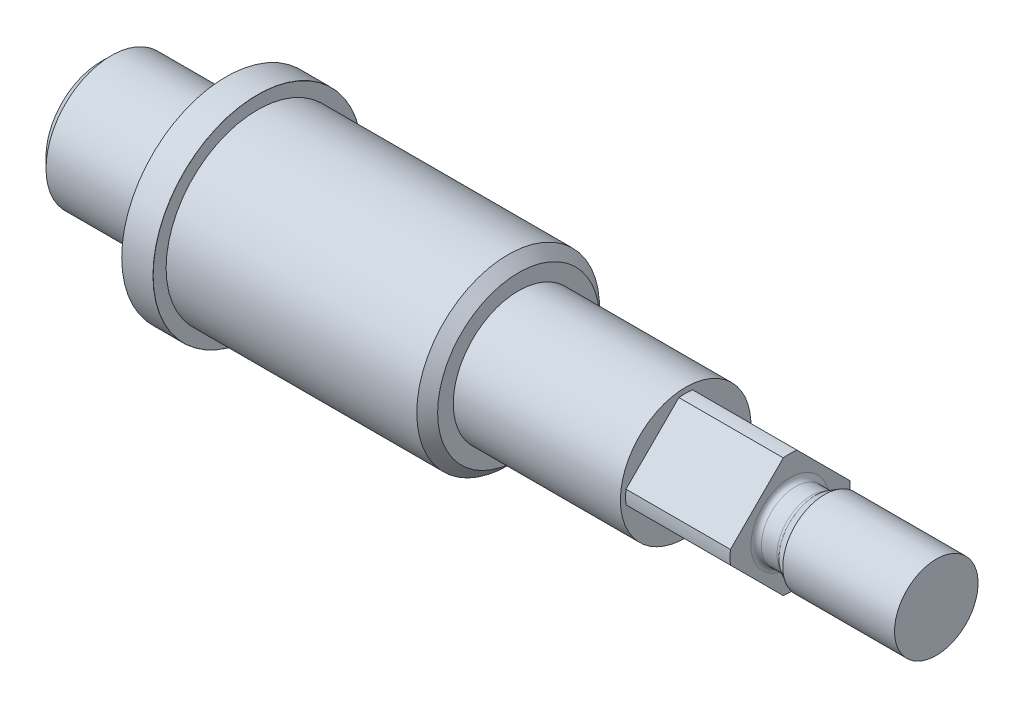
ISO-10303-21;
HEADER;
FILE_DESCRIPTION(('STEP AP214'),'2;1');
FILE_NAME('part.step','',(''),(''),'','','');
FILE_SCHEMA(('AUTOMOTIVE_DESIGN { 1 0 10303 214 1 1 1 1 }'));
ENDSEC;
DATA;
#1=APPLICATION_CONTEXT('core data for automotive mechanical design processes');
#2=APPLICATION_PROTOCOL_DEFINITION('international standard','automotive_design',2000,#1);
#3=PRODUCT_CONTEXT('',#1,'mechanical');
#4=PRODUCT('Part','Part','',(#3));
#5=PRODUCT_RELATED_PRODUCT_CATEGORY('part','',(#4));
#6=PRODUCT_DEFINITION_FORMATION('','',#4);
#7=PRODUCT_DEFINITION_CONTEXT('part definition',#1,'design');
#8=PRODUCT_DEFINITION('design','',#6,#7);
#9=PRODUCT_DEFINITION_SHAPE('','',#8);
#10=(LENGTH_UNIT() NAMED_UNIT(*) SI_UNIT(.MILLI.,.METRE.));
#11=(NAMED_UNIT(*) PLANE_ANGLE_UNIT() SI_UNIT($,.RADIAN.));
#12=(NAMED_UNIT(*) SI_UNIT($,.STERADIAN.) SOLID_ANGLE_UNIT());
#13=UNCERTAINTY_MEASURE_WITH_UNIT(LENGTH_MEASURE(1.E-05),#10,'distance_accuracy_value','');
#14=(GEOMETRIC_REPRESENTATION_CONTEXT(3) GLOBAL_UNCERTAINTY_ASSIGNED_CONTEXT((#13)) GLOBAL_UNIT_ASSIGNED_CONTEXT((#10,
#11,#12)) REPRESENTATION_CONTEXT('',''));
#15=CARTESIAN_POINT('',(0.,0.,0.));
#16=DIRECTION('',(0.,0.,1.));
#17=DIRECTION('',(1.,0.,0.));
#18=AXIS2_PLACEMENT_3D('',#15,#16,#17);
#19=CARTESIAN_POINT('',(-33.02,0.,-20.));
#20=DIRECTION('',(0.,0.,1.));
#21=DIRECTION('',(1.,0.,0.));
#22=AXIS2_PLACEMENT_3D('',#19,#20,#21);
#23=CYLINDRICAL_SURFACE('',#22,5.);
#24=CARTESIAN_POINT('',(-33.02,0.,-12.5));
#25=DIRECTION('',(0.,0.,1.));
#26=DIRECTION('',(1.,0.,0.));
#27=AXIS2_PLACEMENT_3D('',#24,#25,#26);
#28=CIRCLE('',#27,5.);
#29=CARTESIAN_POINT('',(-33.02,5.,-12.5));
#30=VERTEX_POINT('',#29);
#31=CARTESIAN_POINT('',(-33.02,-5.,-12.5));
#32=VERTEX_POINT('',#31);
#33=EDGE_CURVE('E147',#30,#32,#28,.T.);
#34=ORIENTED_EDGE('',*,*,#33,.T.);
#35=DIRECTION('',(0.,0.,1.));
#36=VECTOR('',#35,1.);
#37=CARTESIAN_POINT('',(-33.02,-5.,-20.));
#38=LINE('',#37,#36);
#39=CARTESIAN_POINT('',(-33.02,-5.,-16.7705098312484));
#40=VERTEX_POINT('',#39);
#41=EDGE_CURVE('E135',#40,#32,#38,.T.);
#42=ORIENTED_EDGE('',*,*,#41,.F.);
#43=CARTESIAN_POINT('',(-33.02,5.,-16.7705098312484));
#44=CARTESIAN_POINT('',(-33.1575437669468,5.00001814544053,-16.7704912725158));
#45=CARTESIAN_POINT('',(-33.2950806220229,4.99432529208164,-16.7722013219269));
#46=CARTESIAN_POINT('',(-33.5691111892844,4.97165222541634,-16.7789431019967));
#47=CARTESIAN_POINT('',(-33.7056051118428,4.95467435267923,-16.7839741438635));
#48=CARTESIAN_POINT('',(-33.9762584540195,4.90961903685605,-16.7972068372471));
#49=CARTESIAN_POINT('',(-34.1104226248333,4.88156789644729,-16.8054009743523));
#50=CARTESIAN_POINT('',(-34.3757996419888,4.81461674604718,-16.8247046364186));
#51=CARTESIAN_POINT('',(-34.507012422422,4.77571649404059,-16.8358142264156));
#52=CARTESIAN_POINT('',(-34.7655316606223,4.68740449021953,-16.8606149796878));
#53=CARTESIAN_POINT('',(-34.892840055364,4.63799805032664,-16.874304837985));
#54=CARTESIAN_POINT('',(-35.1427993627257,4.52905522001709,-16.9038705765848));
#55=CARTESIAN_POINT('',(-35.2654485233715,4.46951506432955,-16.9197472690052));
#56=CARTESIAN_POINT('',(-35.625208360307,4.27631278448765,-16.9699997678901));
#57=CARTESIAN_POINT('',(-35.8542983618955,4.12801150136262,-17.007014905076));
#58=CARTESIAN_POINT('',(-36.2905139648693,3.79229915782691,-17.0850471293107));
#59=CARTESIAN_POINT('',(-36.496920274657,3.60397767000144,-17.1261428352533));
#60=CARTESIAN_POINT('',(-36.8757376930736,3.19544341696382,-17.2070462516998));
#61=CARTESIAN_POINT('',(-37.048143164041,2.97522537348191,-17.2468537476932));
#62=CARTESIAN_POINT('',(-37.3570780919675,2.5041085165938,-17.3215844019062));
#63=CARTESIAN_POINT('',(-37.4928809242985,2.25271539483174,-17.3564029869975));
#64=CARTESIAN_POINT('',(-37.7200077123923,1.72950937060037,-17.4163145657263));
#65=CARTESIAN_POINT('',(-37.8113423051881,1.45770136944961,-17.4414098849257));
#66=CARTESIAN_POINT('',(-37.9445857008507,0.908899275051303,-17.4784878135792));
#67=CARTESIAN_POINT('',(-37.9877218545897,0.632225504452072,-17.4907954521753));
#68=CARTESIAN_POINT('',(-38.0272166941546,0.0753060921048364,-17.5020523750682));
#69=CARTESIAN_POINT('',(-38.0235833309957,-0.204938934421976,-17.5010039299558));
#70=CARTESIAN_POINT('',(-37.9704845198055,-0.752451373530216,-17.4859002467781));
#71=CARTESIAN_POINT('',(-37.9223476007258,-1.0198597093415,-17.4722220494947));
#72=CARTESIAN_POINT('',(-37.7837591704515,-1.54263514692821,-17.433846479088));
#73=CARTESIAN_POINT('',(-37.6933055229895,-1.79800164008106,-17.4091485496606));
#74=CARTESIAN_POINT('',(-37.4717336287344,-2.29267928834747,-17.3509771517082));
#75=CARTESIAN_POINT('',(-37.3401810479175,-2.53178407311227,-17.3174105731756));
#76=CARTESIAN_POINT('',(-37.0403556664245,-2.98504901208546,-17.245062612945));
#77=CARTESIAN_POINT('',(-36.8720754127235,-3.19920408978386,-17.2062801734237));
#78=CARTESIAN_POINT('',(-36.5923726411755,-3.50113424709606,-17.1465202223136));
#79=CARTESIAN_POINT('',(-36.4926361356536,-3.60007423743551,-17.1259700648702));
#80=CARTESIAN_POINT('',(-36.2851797576601,-3.78923134613091,-17.0851123940087));
#81=CARTESIAN_POINT('',(-36.1774626601299,-3.87945147156873,-17.0648047990745));
#82=CARTESIAN_POINT('',(-35.9546549590068,-4.05062437518906,-17.0249868857383));
#83=CARTESIAN_POINT('',(-35.8395594701279,-4.13157091233148,-17.005477109874));
#84=CARTESIAN_POINT('',(-35.602839206299,-4.28353981460235,-16.9678346429649));
#85=CARTESIAN_POINT('',(-35.4812169966662,-4.35456603991598,-16.9497014175386));
#86=CARTESIAN_POINT('',(-35.2310840486818,-4.48679157824972,-16.9151829895461));
#87=CARTESIAN_POINT('',(-35.1025213722029,-4.5478971849676,-16.898814896638));
#88=CARTESIAN_POINT('',(-34.84045850364,-4.65898872141545,-16.8685251216221));
#89=CARTESIAN_POINT('',(-34.7069603422388,-4.70897916633162,-16.8546024466245));
#90=CARTESIAN_POINT('',(-34.4360789886437,-4.79739484975374,-16.829649854127));
#91=CARTESIAN_POINT('',(-34.2987000207409,-4.83583217063301,-16.8186169160755));
#92=CARTESIAN_POINT('',(-34.0210044543476,-4.90084834749729,-16.7997865631929));
#93=CARTESIAN_POINT('',(-33.8806892484807,-4.92743269748005,-16.7919876494693));
#94=CARTESIAN_POINT('',(-33.6203348857874,-4.96528740578587,-16.7808301521248));
#95=CARTESIAN_POINT('',(-33.5005683702716,-4.97830600651658,-16.776966894118));
#96=CARTESIAN_POINT('',(-33.2605377051843,-4.99566040544728,-16.7718034889731));
#97=CARTESIAN_POINT('',(-33.140274596223,-5.00000944654161,-16.7704994326599));
#98=CARTESIAN_POINT('',(-33.02,-5.,-16.7705098312484));
#99=B_SPLINE_CURVE_WITH_KNOTS('',3,(#43,#44,#45,#46,#47,#48,#49,#50,#51,#52,#53,#54,#55,#56,#57,
#58,#59,#60,#61,#62,#63,#64,#65,#66,#67,#68,#69,#70,#71,#72,#73,#74,#75,#76,#77,#78,#79,#80,#81,
#82,#83,#84,#85,#86,#87,#88,#89,#90,#91,#92,#93,#94,#95,#96,#97,#98),.UNSPECIFIED.,.F.,.F.,(4,2,
2,2,2,2,2,2,2,2,2,2,2,2,2,2,2,2,2,2,2,2,2,2,2,2,2,4),(0.,0.412492178804547,0.824898831357982,
1.23633171981251,1.64777378699039,2.05900832185038,2.47039598941261,3.29264569343991,
4.13611232627188,4.9797186965021,5.83900986868947,6.69809539287326,7.53476732988532,
8.3712970310193,9.18363381655588,9.99601161556285,10.8172828992968,11.6387209961027,
12.0642579015972,12.489647531354,12.9153217832844,13.3408299328975,13.7701489130555,
14.1992931759112,14.6279870611799,15.056482034464,15.4177510461265,15.7784677892952),.UNSPECIFIED.);
#100=CARTESIAN_POINT('',(-33.02,5.,-16.7705098312484));
#101=VERTEX_POINT('',#100);
#102=EDGE_CURVE('E284',#101,#40,#99,.T.);
#103=ORIENTED_EDGE('',*,*,#102,.F.);
#104=DIRECTION('',(0.,0.,1.));
#105=VECTOR('',#104,1.);
#106=CARTESIAN_POINT('',(-33.02,5.,-20.));
#107=LINE('',#106,#105);
#108=EDGE_CURVE('E148',#101,#30,#107,.T.);
#109=ORIENTED_EDGE('',*,*,#108,.T.);
#110=EDGE_LOOP('',(#34,#42,#103,#109));
#111=FACE_BOUND('',#110,.T.);
#112=ADVANCED_FACE('F43',(#111),#23,.F.);
#113=CARTESIAN_POINT('',(-33.02,5.,-20.));
#114=DIRECTION('',(0.,1.,0.));
#115=DIRECTION('',(0.,0.,1.));
#116=AXIS2_PLACEMENT_3D('',#113,#114,#115);
#117=PLANE('',#116);
#118=DIRECTION('',(-1.,0.,0.));
#119=VECTOR('',#118,1.);
#120=CARTESIAN_POINT('',(-33.02,5.,-12.5));
#121=LINE('',#120,#119);
#122=CARTESIAN_POINT('',(-17.02,5.,-12.5));
#123=VERTEX_POINT('',#122);
#124=EDGE_CURVE('E59',#123,#30,#121,.T.);
#125=ORIENTED_EDGE('',*,*,#124,.T.);
#126=ORIENTED_EDGE('',*,*,#108,.F.);
#127=DIRECTION('',(-1.,0.,0.));
#128=VECTOR('',#127,1.);
#129=CARTESIAN_POINT('',(-92.9215805869017,5.,-16.7705098312484));
#130=LINE('',#129,#128);
#131=CARTESIAN_POINT('',(-17.02,5.,-16.7705098312484));
#132=VERTEX_POINT('',#131);
#133=EDGE_CURVE('E263',#132,#101,#130,.T.);
#134=ORIENTED_EDGE('',*,*,#133,.F.);
#135=DIRECTION('',(0.,0.,1.));
#136=VECTOR('',#135,1.);
#137=CARTESIAN_POINT('',(-17.02,5.,-20.));
#138=LINE('',#137,#136);
#139=EDGE_CURVE('E158',#132,#123,#138,.T.);
#140=ORIENTED_EDGE('',*,*,#139,.T.);
#141=EDGE_LOOP('',(#125,#126,#134,#140));
#142=FACE_BOUND('',#141,.T.);
#143=ADVANCED_FACE('F274',(#142),#117,.F.);
#144=CARTESIAN_POINT('',(-17.02,0.,-20.));
#145=DIRECTION('',(0.,0.,1.));
#146=DIRECTION('',(1.,0.,0.));
#147=AXIS2_PLACEMENT_3D('',#144,#145,#146);
#148=CYLINDRICAL_SURFACE('',#147,5.);
#149=CARTESIAN_POINT('',(-17.02,0.,-12.5));
#150=DIRECTION('',(0.,0.,1.));
#151=DIRECTION('',(-1.,0.,0.));
#152=AXIS2_PLACEMENT_3D('',#149,#150,#151);
#153=CIRCLE('',#152,5.);
#154=CARTESIAN_POINT('',(-17.02,-5.,-12.5));
#155=VERTEX_POINT('',#154);
#156=EDGE_CURVE('E67',#155,#123,#153,.T.);
#157=ORIENTED_EDGE('',*,*,#156,.T.);
#158=ORIENTED_EDGE('',*,*,#139,.F.);
#159=CARTESIAN_POINT('',(-17.02,-5.,-16.7705098312484));
#160=CARTESIAN_POINT('',(-16.8824562330531,-5.00001814544053,-16.7704912725158));
#161=CARTESIAN_POINT('',(-16.7449193779771,-4.99432529208164,-16.7722013219269));
#162=CARTESIAN_POINT('',(-16.4708888107156,-4.97165222541633,-16.7789431019967));
#163=CARTESIAN_POINT('',(-16.3343948881572,-4.95467435267922,-16.7839741438635));
#164=CARTESIAN_POINT('',(-16.0637415459805,-4.90961903685604,-16.7972068372471));
#165=CARTESIAN_POINT('',(-15.9295773751666,-4.88156789644729,-16.8054009743523));
#166=CARTESIAN_POINT('',(-15.6642003580112,-4.81461674604717,-16.8247046364186));
#167=CARTESIAN_POINT('',(-15.532987577578,-4.77571649404058,-16.8358142264156));
#168=CARTESIAN_POINT('',(-15.2744683393777,-4.68740449021953,-16.8606149796878));
#169=CARTESIAN_POINT('',(-15.1471599446359,-4.63799805032664,-16.874304837985));
#170=CARTESIAN_POINT('',(-14.8972006372743,-4.52905522001708,-16.9038705765848));
#171=CARTESIAN_POINT('',(-14.7745514766285,-4.46951506432954,-16.9197472690052));
#172=CARTESIAN_POINT('',(-14.414791639693,-4.27631278448764,-16.9699997678901));
#173=CARTESIAN_POINT('',(-14.1857016381045,-4.12801150136261,-17.007014905076));
#174=CARTESIAN_POINT('',(-13.7494860351306,-3.7922991578269,-17.0850471293107));
#175=CARTESIAN_POINT('',(-13.543079725343,-3.60397767000143,-17.1261428352533));
#176=CARTESIAN_POINT('',(-13.1642623069264,-3.19544341696382,-17.2070462516998));
#177=CARTESIAN_POINT('',(-12.991856835959,-2.97522537348191,-17.2468537476932));
#178=CARTESIAN_POINT('',(-12.6829219080325,-2.5041085165938,-17.3215844019062));
#179=CARTESIAN_POINT('',(-12.5471190757015,-2.25271539483174,-17.3564029869975));
#180=CARTESIAN_POINT('',(-12.3199922876077,-1.72950937060037,-17.4163145657263));
#181=CARTESIAN_POINT('',(-12.2286576948119,-1.45770136944961,-17.4414098849257));
#182=CARTESIAN_POINT('',(-12.0954142991493,-0.908899275051306,-17.4784878135792));
#183=CARTESIAN_POINT('',(-12.0522781454103,-0.632225504452074,-17.4907954521753));
#184=CARTESIAN_POINT('',(-12.0127833058454,-0.075306092104837,-17.5020523750682));
#185=CARTESIAN_POINT('',(-12.0164166690043,0.204938934421976,-17.5010039299558));
#186=CARTESIAN_POINT('',(-12.0695154801945,0.752451373530216,-17.4859002467781));
#187=CARTESIAN_POINT('',(-12.1176523992742,1.0198597093415,-17.4722220494947));
#188=CARTESIAN_POINT('',(-12.2562408295485,1.54263514692821,-17.433846479088));
#189=CARTESIAN_POINT('',(-12.3466944770104,1.79800164008105,-17.4091485496606));
#190=CARTESIAN_POINT('',(-12.5682663712656,2.29267928834747,-17.3509771517082));
#191=CARTESIAN_POINT('',(-12.6998189520825,2.53178407311227,-17.3174105731756));
#192=CARTESIAN_POINT('',(-12.9996443335755,2.98504901208546,-17.2450626129451));
#193=CARTESIAN_POINT('',(-13.1679245872765,3.19920408978386,-17.2062801734237));
#194=CARTESIAN_POINT('',(-13.4476273588245,3.50113424709605,-17.1465202223136));
#195=CARTESIAN_POINT('',(-13.5473638643464,3.6000742374355,-17.1259700648702));
#196=CARTESIAN_POINT('',(-13.7548202423399,3.78923134613091,-17.0851123940087));
#197=CARTESIAN_POINT('',(-13.8625373398701,3.87945147156873,-17.0648047990745));
#198=CARTESIAN_POINT('',(-14.0853450409931,4.05062437518906,-17.0249868857383));
#199=CARTESIAN_POINT('',(-14.2004405298721,4.13157091233147,-17.005477109874));
#200=CARTESIAN_POINT('',(-14.437160793701,4.28353981460234,-16.9678346429649));
#201=CARTESIAN_POINT('',(-14.5587830033338,4.35456603991597,-16.9497014175386));
#202=CARTESIAN_POINT('',(-14.8089159513182,4.48679157824972,-16.9151829895461));
#203=CARTESIAN_POINT('',(-14.9374786277971,4.54789718496759,-16.898814896638));
#204=CARTESIAN_POINT('',(-15.19954149636,4.65898872141544,-16.8685251216221));
#205=CARTESIAN_POINT('',(-15.3330396577612,4.70897916633162,-16.8546024466245));
#206=CARTESIAN_POINT('',(-15.6039210113563,4.79739484975373,-16.829649854127));
#207=CARTESIAN_POINT('',(-15.7412999792591,4.835832170633,-16.8186169160755));
#208=CARTESIAN_POINT('',(-16.0189955456524,4.90084834749728,-16.7997865631929));
#209=CARTESIAN_POINT('',(-16.1593107515193,4.92743269748005,-16.7919876494693));
#210=CARTESIAN_POINT('',(-16.4196651142126,4.96528740578586,-16.7808301521248));
#211=CARTESIAN_POINT('',(-16.5394316297283,4.97830600651657,-16.776966894118));
#212=CARTESIAN_POINT('',(-16.7794622948156,4.99566040544727,-16.7718034889731));
#213=CARTESIAN_POINT('',(-16.899725403777,5.00000944654161,-16.7704994326599));
#214=CARTESIAN_POINT('',(-17.02,5.,-16.7705098312484));
#215=B_SPLINE_CURVE_WITH_KNOTS('',3,(#159,#160,#161,#162,#163,#164,#165,#166,#167,#168,#169,
#170,#171,#172,#173,#174,#175,#176,#177,#178,#179,#180,#181,#182,#183,#184,#185,#186,#187,#188,
#189,#190,#191,#192,#193,#194,#195,#196,#197,#198,#199,#200,#201,#202,#203,#204,#205,#206,#207,
#208,#209,#210,#211,#212,#213,#214),.UNSPECIFIED.,.F.,.F.,(4,2,2,2,2,2,2,2,2,2,2,2,2,2,2,2,2,2,
2,2,2,2,2,2,2,2,2,4),(0.,0.412492178804543,0.824898831357978,1.23633171981252,1.64777378699039,
2.05900832185038,2.47039598941262,3.29264569343991,4.13611232627188,4.97971869650209,
5.83900986868947,6.69809539287324,7.53476732988531,8.37129703101929,9.18363381655587,
9.99601161556284,10.8172828992968,11.6387209961027,12.0642579015972,12.489647531354,
12.9153217832843,13.3408299328975,13.7701489130554,14.1992931759112,14.6279870611799,
15.056482034464,15.4177510461265,15.7784677892952),.UNSPECIFIED.);
#216=CARTESIAN_POINT('',(-17.02,-5.00000000000004,-16.7705098312484));
#217=VERTEX_POINT('',#216);
#218=EDGE_CURVE('E254',#217,#132,#215,.T.);
#219=ORIENTED_EDGE('',*,*,#218,.F.);
#220=DIRECTION('',(0.,0.,1.));
#221=VECTOR('',#220,1.);
#222=CARTESIAN_POINT('',(-17.02,-5.,-20.));
#223=LINE('',#222,#221);
#224=EDGE_CURVE('E144',#217,#155,#223,.T.);
#225=ORIENTED_EDGE('',*,*,#224,.T.);
#226=EDGE_LOOP('',(#157,#158,#219,#225));
#227=FACE_BOUND('',#226,.T.);
#228=ADVANCED_FACE('F269',(#227),#148,.F.);
#229=CARTESIAN_POINT('',(-17.02,-5.,-20.));
#230=DIRECTION('',(0.,-1.,0.));
#231=DIRECTION('',(1.,0.,0.));
#232=AXIS2_PLACEMENT_3D('',#229,#230,#231);
#233=PLANE('',#232);
#234=DIRECTION('',(1.,0.,0.));
#235=VECTOR('',#234,1.);
#236=CARTESIAN_POINT('',(-17.02,-5.,-12.5));
#237=LINE('',#236,#235);
#238=EDGE_CURVE('E139',#32,#155,#237,.T.);
#239=ORIENTED_EDGE('',*,*,#238,.T.);
#240=ORIENTED_EDGE('',*,*,#224,.F.);
#241=DIRECTION('',(-1.,0.,0.));
#242=VECTOR('',#241,1.);
#243=CARTESIAN_POINT('',(-92.9215805869017,-5.00000000000004,-16.7705098312484));
#244=LINE('',#243,#242);
#245=EDGE_CURVE('E141',#40,#217,#244,.F.);
#246=ORIENTED_EDGE('',*,*,#245,.F.);
#247=ORIENTED_EDGE('',*,*,#41,.T.);
#248=EDGE_LOOP('',(#239,#240,#246,#247));
#249=FACE_BOUND('',#248,.T.);
#250=ADVANCED_FACE('F137',(#249),#233,.F.);
#251=CARTESIAN_POINT('',(52.,0.,0.));
#252=DIRECTION('',(1.,0.,0.));
#253=DIRECTION('',(0.,0.,-1.));
#254=AXIS2_PLACEMENT_3D('',#251,#252,#253);
#255=PLANE('',#254);
#256=DIRECTION('',(0.,-0.707106781186549,-0.707106781186546));
#257=VECTOR('',#256,1.);
#258=CARTESIAN_POINT('',(52.,11.426075213508,-1.30184684784988));
#259=LINE('',#258,#257);
#260=CARTESIAN_POINT('',(52.,11.426075213508,-1.30184684784988));
#261=VERTEX_POINT('',#260);
#262=CARTESIAN_POINT('',(52.,1.30184684784976,-11.4260752135081));
#263=VERTEX_POINT('',#262);
#264=EDGE_CURVE('E178',#261,#263,#259,.T.);
#265=ORIENTED_EDGE('',*,*,#264,.F.);
#266=CARTESIAN_POINT('',(52.,0.,0.));
#267=DIRECTION('',(-1.,0.,0.));
#268=DIRECTION('',(0.,0.,1.));
#269=AXIS2_PLACEMENT_3D('',#266,#267,#268);
#270=CIRCLE('',#269,11.5);
#271=CARTESIAN_POINT('',(52.,11.426075213508,1.30184684784988));
#272=VERTEX_POINT('',#271);
#273=EDGE_CURVE('E222',#272,#261,#270,.T.);
#274=ORIENTED_EDGE('',*,*,#273,.F.);
#275=DIRECTION('',(0.,-0.707106781186549,0.707106781186546));
#276=VECTOR('',#275,1.);
#277=CARTESIAN_POINT('',(52.,11.426075213508,1.30184684784988));
#278=LINE('',#277,#276);
#279=CARTESIAN_POINT('',(52.,1.30184684784976,11.4260752135081));
#280=VERTEX_POINT('',#279);
#281=EDGE_CURVE('E166',#272,#280,#278,.T.);
#282=ORIENTED_EDGE('',*,*,#281,.T.);
#283=CARTESIAN_POINT('',(52.,-1.30184684784976,11.4260752135081));
#284=VERTEX_POINT('',#283);
#285=EDGE_CURVE('E218',#284,#280,#270,.T.);
#286=ORIENTED_EDGE('',*,*,#285,.F.);
#287=DIRECTION('',(0.,0.707106781186549,0.707106781186546));
#288=VECTOR('',#287,1.);
#289=CARTESIAN_POINT('',(52.,-11.426075213508,1.30184684784988));
#290=LINE('',#289,#288);
#291=CARTESIAN_POINT('',(52.,-11.426075213508,1.30184684784988));
#292=VERTEX_POINT('',#291);
#293=EDGE_CURVE('E177',#292,#284,#290,.T.);
#294=ORIENTED_EDGE('',*,*,#293,.F.);
#295=CARTESIAN_POINT('',(52.,-11.426075213508,-1.30184684784988));
#296=VERTEX_POINT('',#295);
#297=EDGE_CURVE('E221',#296,#292,#270,.T.);
#298=ORIENTED_EDGE('',*,*,#297,.F.);
#299=DIRECTION('',(0.,0.707106781186549,-0.707106781186546));
#300=VECTOR('',#299,1.);
#301=CARTESIAN_POINT('',(52.,-11.426075213508,-1.30184684784988));
#302=LINE('',#301,#300);
#303=CARTESIAN_POINT('',(52.,-1.30184684784976,-11.4260752135081));
#304=VERTEX_POINT('',#303);
#305=EDGE_CURVE('E180',#296,#304,#302,.T.);
#306=ORIENTED_EDGE('',*,*,#305,.T.);
#307=EDGE_CURVE('E579',#263,#304,#270,.T.);
#308=ORIENTED_EDGE('',*,*,#307,.F.);
#309=EDGE_LOOP('',(#265,#274,#282,#286,#294,#298,#306,#308));
#310=FACE_BOUND('',#309,.T.);
#311=CARTESIAN_POINT('',(52.,0.,0.));
#312=DIRECTION('',(-1.,0.,0.));
#313=DIRECTION('',(0.,0.,1.));
#314=AXIS2_PLACEMENT_3D('',#311,#312,#313);
#315=CIRCLE('',#314,7.5);
#316=CARTESIAN_POINT('',(52.,0.,7.5));
#317=VERTEX_POINT('',#316);
#318=EDGE_CURVE('E223',#317,#317,#315,.T.);
#319=ORIENTED_EDGE('',*,*,#318,.T.);
#320=EDGE_LOOP('',(#319));
#321=FACE_BOUND('',#320,.T.);
#322=ADVANCED_FACE('F278',(#310,#321),#255,.T.);
#323=CARTESIAN_POINT('',(-92.9215805869017,0.,0.));
#324=DIRECTION('',(-1.,0.,0.));
#325=DIRECTION('',(0.,0.,1.));
#326=AXIS2_PLACEMENT_3D('',#323,#324,#325);
#327=CYLINDRICAL_SURFACE('',#326,11.5);
#328=ORIENTED_EDGE('',*,*,#273,.T.);
#329=DIRECTION('',(1.,0.,0.));
#330=VECTOR('',#329,1.);
#331=CARTESIAN_POINT('',(32.,11.426075213508,-1.30184684784988));
#332=LINE('',#331,#330);
#333=CARTESIAN_POINT('',(32.,11.426075213508,-1.30184684784988));
#334=VERTEX_POINT('',#333);
#335=EDGE_CURVE('E175',#334,#261,#332,.T.);
#336=ORIENTED_EDGE('',*,*,#335,.F.);
#337=CARTESIAN_POINT('',(32.,0.,0.));
#338=DIRECTION('',(-1.,0.,0.));
#339=DIRECTION('',(0.,0.,1.));
#340=AXIS2_PLACEMENT_3D('',#337,#338,#339);
#341=CIRCLE('',#340,11.5);
#342=CARTESIAN_POINT('',(32.,11.4260752135081,1.3018468478498));
#343=VERTEX_POINT('',#342);
#344=EDGE_CURVE('E217',#343,#334,#341,.T.);
#345=ORIENTED_EDGE('',*,*,#344,.F.);
#346=DIRECTION('',(1.,0.,0.));
#347=VECTOR('',#346,1.);
#348=CARTESIAN_POINT('',(32.,11.426075213508,1.30184684784988));
#349=LINE('',#348,#347);
#350=EDGE_CURVE('E157',#343,#272,#349,.T.);
#351=ORIENTED_EDGE('',*,*,#350,.T.);
#352=EDGE_LOOP('',(#328,#336,#345,#351));
#353=FACE_BOUND('',#352,.T.);
#354=ADVANCED_FACE('F385',(#353),#327,.T.);
#355=CARTESIAN_POINT('',(32.,1.30184684784976,-11.4260752135081));
#356=VERTEX_POINT('',#355);
#357=CARTESIAN_POINT('',(32.,-1.30184684784976,-11.4260752135081));
#358=VERTEX_POINT('',#357);
#359=EDGE_CURVE('E581',#356,#358,#341,.T.);
#360=ORIENTED_EDGE('',*,*,#359,.F.);
#361=DIRECTION('',(1.,0.,0.));
#362=VECTOR('',#361,1.);
#363=CARTESIAN_POINT('',(32.,1.30184684784976,-11.4260752135081));
#364=LINE('',#363,#362);
#365=EDGE_CURVE('E171',#356,#263,#364,.T.);
#366=ORIENTED_EDGE('',*,*,#365,.T.);
#367=ORIENTED_EDGE('',*,*,#307,.T.);
#368=DIRECTION('',(1.,0.,0.));
#369=VECTOR('',#368,1.);
#370=CARTESIAN_POINT('',(32.,-1.30184684784976,-11.4260752135081));
#371=LINE('',#370,#369);
#372=EDGE_CURVE('E191',#358,#304,#371,.T.);
#373=ORIENTED_EDGE('',*,*,#372,.F.);
#374=EDGE_LOOP('',(#360,#366,#367,#373));
#375=FACE_BOUND('',#374,.T.);
#376=ADVANCED_FACE('F389',(#375),#327,.T.);
#377=ORIENTED_EDGE('',*,*,#297,.T.);
#378=DIRECTION('',(1.,0.,0.));
#379=VECTOR('',#378,1.);
#380=CARTESIAN_POINT('',(32.,-11.426075213508,1.30184684784988));
#381=LINE('',#380,#379);
#382=CARTESIAN_POINT('',(32.,-11.426075213508,1.30184684784988));
#383=VERTEX_POINT('',#382);
#384=EDGE_CURVE('E169',#383,#292,#381,.T.);
#385=ORIENTED_EDGE('',*,*,#384,.F.);
#386=CARTESIAN_POINT('',(32.,-11.4260752135081,-1.3018468478498));
#387=VERTEX_POINT('',#386);
#388=EDGE_CURVE('E216',#387,#383,#341,.T.);
#389=ORIENTED_EDGE('',*,*,#388,.F.);
#390=DIRECTION('',(1.,0.,0.));
#391=VECTOR('',#390,1.);
#392=CARTESIAN_POINT('',(32.,-11.426075213508,-1.30184684784988));
#393=LINE('',#392,#391);
#394=EDGE_CURVE('E194',#387,#296,#393,.T.);
#395=ORIENTED_EDGE('',*,*,#394,.T.);
#396=EDGE_LOOP('',(#377,#385,#389,#395));
#397=FACE_BOUND('',#396,.T.);
#398=ADVANCED_FACE('F516',(#397),#327,.T.);
#399=CARTESIAN_POINT('',(32.,-1.30184684784976,11.4260752135081));
#400=VERTEX_POINT('',#399);
#401=CARTESIAN_POINT('',(32.,1.30184684784976,11.4260752135081));
#402=VERTEX_POINT('',#401);
#403=EDGE_CURVE('E213',#400,#402,#341,.T.);
#404=ORIENTED_EDGE('',*,*,#403,.F.);
#405=DIRECTION('',(1.,0.,0.));
#406=VECTOR('',#405,1.);
#407=CARTESIAN_POINT('',(32.,-1.30184684784976,11.4260752135081));
#408=LINE('',#407,#406);
#409=EDGE_CURVE('E182',#400,#284,#408,.T.);
#410=ORIENTED_EDGE('',*,*,#409,.T.);
#411=ORIENTED_EDGE('',*,*,#285,.T.);
#412=DIRECTION('',(1.,0.,0.));
#413=VECTOR('',#412,1.);
#414=CARTESIAN_POINT('',(32.,1.30184684784976,11.4260752135081));
#415=LINE('',#414,#413);
#416=EDGE_CURVE('E161',#402,#280,#415,.T.);
#417=ORIENTED_EDGE('',*,*,#416,.F.);
#418=EDGE_LOOP('',(#404,#410,#411,#417));
#419=FACE_BOUND('',#418,.T.);
#420=ADVANCED_FACE('F362',(#419),#327,.T.);
#421=CARTESIAN_POINT('',(-80.,0.,0.));
#422=DIRECTION('',(-1.,0.,0.));
#423=DIRECTION('',(0.,0.,1.));
#424=AXIS2_PLACEMENT_3D('',#421,#422,#423);
#425=PLANE('',#424);
#426=CARTESIAN_POINT('',(-80.,0.,0.));
#427=DIRECTION('',(-1.,0.,0.));
#428=DIRECTION('',(0.,0.,1.));
#429=AXIS2_PLACEMENT_3D('',#426,#427,#428);
#430=CIRCLE('',#429,10.5);
#431=CARTESIAN_POINT('',(-80.,0.,10.5));
#432=VERTEX_POINT('',#431);
#433=EDGE_CURVE('E52',#432,#432,#430,.T.);
#434=ORIENTED_EDGE('',*,*,#433,.T.);
#435=EDGE_LOOP('',(#434));
#436=FACE_BOUND('',#435,.T.);
#437=ADVANCED_FACE('F292',(#436),#425,.T.);
#438=CARTESIAN_POINT('',(80.,0.,0.));
#439=DIRECTION('',(-1.,0.,0.));
#440=DIRECTION('',(0.,0.,1.));
#441=AXIS2_PLACEMENT_3D('',#438,#439,#440);
#442=PLANE('',#441);
#443=CARTESIAN_POINT('',(80.,0.,0.));
#444=DIRECTION('',(-1.,0.,0.));
#445=DIRECTION('',(0.,0.,1.));
#446=AXIS2_PLACEMENT_3D('',#443,#444,#445);
#447=CIRCLE('',#446,8.);
#448=CARTESIAN_POINT('',(80.,0.,8.));
#449=VERTEX_POINT('',#448);
#450=EDGE_CURVE('E232',#449,#449,#447,.T.);
#451=ORIENTED_EDGE('',*,*,#450,.F.);
#452=EDGE_LOOP('',(#451));
#453=FACE_BOUND('',#452,.T.);
#454=ADVANCED_FACE('F361',(#453),#442,.F.);
#455=CARTESIAN_POINT('',(-92.9215805869017,0.,0.));
#456=DIRECTION('',(-1.,0.,0.));
#457=DIRECTION('',(0.,0.,1.));
#458=AXIS2_PLACEMENT_3D('',#455,#456,#457);
#459=CYLINDRICAL_SURFACE('',#458,8.);
#460=CARTESIAN_POINT('',(58.5980762113534,0.,0.));
#461=DIRECTION('',(-1.,0.,0.));
#462=DIRECTION('',(0.,0.,1.));
#463=AXIS2_PLACEMENT_3D('',#460,#461,#462);
#464=CIRCLE('',#463,8.);
#465=CARTESIAN_POINT('',(58.5980762113534,0.,8.));
#466=VERTEX_POINT('',#465);
#467=EDGE_CURVE('E238',#466,#466,#464,.F.);
#468=ORIENTED_EDGE('',*,*,#467,.T.);
#469=EDGE_LOOP('',(#468));
#470=FACE_BOUND('',#469,.T.);
#471=ORIENTED_EDGE('',*,*,#450,.T.);
#472=EDGE_LOOP('',(#471));
#473=FACE_BOUND('',#472,.T.);
#474=ADVANCED_FACE('F365',(#470,#473),#459,.T.);
#475=CARTESIAN_POINT('',(56.,0.,0.));
#476=DIRECTION('',(-1.,0.,0.));
#477=DIRECTION('',(0.,0.,1.));
#478=AXIS2_PLACEMENT_3D('',#475,#476,#477);
#479=TOROIDAL_SURFACE('',#478,7.5,1.);
#480=CARTESIAN_POINT('',(56.8660254037844,0.,0.));
#481=DIRECTION('',(-1.,0.,0.));
#482=DIRECTION('',(0.,0.,1.));
#483=AXIS2_PLACEMENT_3D('',#480,#481,#482);
#484=CIRCLE('',#483,6.99999999999997);
#485=CARTESIAN_POINT('',(56.8660254037844,0.,6.99999999999997));
#486=VERTEX_POINT('',#485);
#487=EDGE_CURVE('E235',#486,#486,#484,.T.);
#488=ORIENTED_EDGE('',*,*,#487,.T.);
#489=EDGE_LOOP('',(#488));
#490=FACE_BOUND('',#489,.T.);
#491=CARTESIAN_POINT('',(56.,0.,0.));
#492=DIRECTION('',(-1.,0.,0.));
#493=DIRECTION('',(0.,0.,1.));
#494=AXIS2_PLACEMENT_3D('',#491,#492,#493);
#495=CIRCLE('',#494,6.5);
#496=CARTESIAN_POINT('',(56.,0.,6.5));
#497=VERTEX_POINT('',#496);
#498=EDGE_CURVE('E229',#497,#497,#495,.T.);
#499=ORIENTED_EDGE('',*,*,#498,.F.);
#500=EDGE_LOOP('',(#499));
#501=FACE_BOUND('',#500,.T.);
#502=ADVANCED_FACE('F369',(#490,#501),#479,.F.);
#503=CARTESIAN_POINT('',(-92.9215805869017,0.,0.));
#504=DIRECTION('',(-1.,0.,0.));
#505=DIRECTION('',(0.,0.,1.));
#506=AXIS2_PLACEMENT_3D('',#503,#504,#505);
#507=CYLINDRICAL_SURFACE('',#506,6.5);
#508=ORIENTED_EDGE('',*,*,#498,.T.);
#509=EDGE_LOOP('',(#508));
#510=FACE_BOUND('',#509,.T.);
#511=CARTESIAN_POINT('',(53.,0.,0.));
#512=DIRECTION('',(-1.,0.,0.));
#513=DIRECTION('',(0.,0.,1.));
#514=AXIS2_PLACEMENT_3D('',#511,#512,#513);
#515=CIRCLE('',#514,6.5);
#516=CARTESIAN_POINT('',(53.,0.,6.5));
#517=VERTEX_POINT('',#516);
#518=EDGE_CURVE('E226',#517,#517,#515,.T.);
#519=ORIENTED_EDGE('',*,*,#518,.F.);
#520=EDGE_LOOP('',(#519));
#521=FACE_BOUND('',#520,.T.);
#522=ADVANCED_FACE('F373',(#510,#521),#507,.T.);
#523=CARTESIAN_POINT('',(53.,0.,0.));
#524=DIRECTION('',(-1.,0.,0.));
#525=DIRECTION('',(0.,0.,1.));
#526=AXIS2_PLACEMENT_3D('',#523,#524,#525);
#527=TOROIDAL_SURFACE('',#526,7.5,1.);
#528=ORIENTED_EDGE('',*,*,#318,.F.);
#529=EDGE_LOOP('',(#528));
#530=FACE_BOUND('',#529,.T.);
#531=ORIENTED_EDGE('',*,*,#518,.T.);
#532=EDGE_LOOP('',(#531));
#533=FACE_BOUND('',#532,.T.);
#534=ADVANCED_FACE('F377',(#530,#533),#527,.F.);
#535=CARTESIAN_POINT('',(32.,0.,0.));
#536=DIRECTION('',(-1.,0.,0.));
#537=DIRECTION('',(0.,0.,1.));
#538=AXIS2_PLACEMENT_3D('',#535,#536,#537);
#539=PLANE('',#538);
#540=ORIENTED_EDGE('',*,*,#344,.T.);
#541=DIRECTION('',(0.,-0.707106781186549,-0.707106781186546));
#542=VECTOR('',#541,1.);
#543=CARTESIAN_POINT('',(32.,11.426075213508,-1.30184684784988));
#544=LINE('',#543,#542);
#545=EDGE_CURVE('E174',#334,#356,#544,.T.);
#546=ORIENTED_EDGE('',*,*,#545,.T.);
#547=ORIENTED_EDGE('',*,*,#359,.T.);
#548=DIRECTION('',(0.,0.707106781186549,-0.707106781186546));
#549=VECTOR('',#548,1.);
#550=CARTESIAN_POINT('',(32.,-11.426075213508,-1.30184684784988));
#551=LINE('',#550,#549);
#552=EDGE_CURVE('E189',#387,#358,#551,.T.);
#553=ORIENTED_EDGE('',*,*,#552,.F.);
#554=ORIENTED_EDGE('',*,*,#388,.T.);
#555=DIRECTION('',(0.,0.707106781186549,0.707106781186546));
#556=VECTOR('',#555,1.);
#557=CARTESIAN_POINT('',(32.,-11.426075213508,1.30184684784988));
#558=LINE('',#557,#556);
#559=EDGE_CURVE('E185',#383,#400,#558,.T.);
#560=ORIENTED_EDGE('',*,*,#559,.T.);
#561=ORIENTED_EDGE('',*,*,#403,.T.);
#562=DIRECTION('',(0.,-0.707106781186549,0.707106781186546));
#563=VECTOR('',#562,1.);
#564=CARTESIAN_POINT('',(32.,11.426075213508,1.30184684784988));
#565=LINE('',#564,#563);
#566=EDGE_CURVE('E163',#343,#402,#565,.T.);
#567=ORIENTED_EDGE('',*,*,#566,.F.);
#568=EDGE_LOOP('',(#540,#546,#547,#553,#554,#560,#561,#567));
#569=FACE_BOUND('',#568,.T.);
#570=CARTESIAN_POINT('',(32.,0.,0.));
#571=DIRECTION('',(-1.,0.,0.));
#572=DIRECTION('',(0.,0.,1.));
#573=AXIS2_PLACEMENT_3D('',#570,#571,#572);
#574=CIRCLE('',#573,12.5);
#575=CARTESIAN_POINT('',(32.,0.,12.5));
#576=VERTEX_POINT('',#575);
#577=EDGE_CURVE('E210',#576,#576,#574,.T.);
#578=ORIENTED_EDGE('',*,*,#577,.F.);
#579=EDGE_LOOP('',(#578));
#580=FACE_BOUND('',#579,.T.);
#581=ADVANCED_FACE('F381',(#569,#580),#539,.F.);
#582=CARTESIAN_POINT('',(-92.9215805869017,0.,0.));
#583=DIRECTION('',(-1.,0.,0.));
#584=DIRECTION('',(0.,0.,1.));
#585=AXIS2_PLACEMENT_3D('',#582,#583,#584);
#586=CYLINDRICAL_SURFACE('',#585,12.5);
#587=ORIENTED_EDGE('',*,*,#577,.T.);
#588=EDGE_LOOP('',(#587));
#589=FACE_BOUND('',#588,.T.);
#590=CARTESIAN_POINT('',(0.,0.,0.));
#591=DIRECTION('',(-1.,0.,0.));
#592=DIRECTION('',(0.,0.,1.));
#593=AXIS2_PLACEMENT_3D('',#590,#591,#592);
#594=CIRCLE('',#593,12.5);
#595=CARTESIAN_POINT('',(0.,0.,12.5));
#596=VERTEX_POINT('',#595);
#597=EDGE_CURVE('E207',#596,#596,#594,.T.);
#598=ORIENTED_EDGE('',*,*,#597,.F.);
#599=EDGE_LOOP('',(#598));
#600=FACE_BOUND('',#599,.T.);
#601=ADVANCED_FACE('F393',(#589,#600),#586,.T.);
#602=CARTESIAN_POINT('',(0.,0.,0.));
#603=DIRECTION('',(-1.,0.,0.));
#604=DIRECTION('',(0.,0.,1.));
#605=AXIS2_PLACEMENT_3D('',#602,#603,#604);
#606=PLANE('',#605);
#607=CARTESIAN_POINT('',(0.,0.,0.));
#608=DIRECTION('',(-1.,0.,0.));
#609=DIRECTION('',(0.,0.,1.));
#610=AXIS2_PLACEMENT_3D('',#607,#608,#609);
#611=CIRCLE('',#610,15.5);
#612=CARTESIAN_POINT('',(0.,0.,15.5));
#613=VERTEX_POINT('',#612);
#614=EDGE_CURVE('E244',#613,#613,#611,.F.);
#615=ORIENTED_EDGE('',*,*,#614,.T.);
#616=EDGE_LOOP('',(#615));
#617=FACE_BOUND('',#616,.T.);
#618=ORIENTED_EDGE('',*,*,#597,.T.);
#619=EDGE_LOOP('',(#618));
#620=FACE_BOUND('',#619,.T.);
#621=ADVANCED_FACE('F327',(#617,#620),#606,.F.);
#622=CARTESIAN_POINT('',(-92.9215805869017,0.,0.));
#623=DIRECTION('',(-1.,0.,0.));
#624=DIRECTION('',(0.,0.,1.));
#625=AXIS2_PLACEMENT_3D('',#622,#623,#624);
#626=CYLINDRICAL_SURFACE('',#625,17.5);
#627=ORIENTED_EDGE('',*,*,#133,.T.);
#628=ORIENTED_EDGE('',*,*,#102,.T.);
#629=ORIENTED_EDGE('',*,*,#245,.T.);
#630=ORIENTED_EDGE('',*,*,#218,.T.);
#631=EDGE_LOOP('',(#627,#628,#629,#630));
#632=FACE_BOUND('',#631,.T.);
#633=CARTESIAN_POINT('',(-2.00000000000003,0.,0.));
#634=DIRECTION('',(-1.,0.,0.));
#635=DIRECTION('',(0.,0.,1.));
#636=AXIS2_PLACEMENT_3D('',#633,#634,#635);
#637=CIRCLE('',#636,17.5);
#638=CARTESIAN_POINT('',(-2.00000000000003,0.,17.5));
#639=VERTEX_POINT('',#638);
#640=EDGE_CURVE('E241',#639,#639,#637,.T.);
#641=ORIENTED_EDGE('',*,*,#640,.T.);
#642=EDGE_LOOP('',(#641));
#643=FACE_BOUND('',#642,.T.);
#644=CARTESIAN_POINT('',(-50.,0.,0.));
#645=DIRECTION('',(-1.,0.,0.));
#646=DIRECTION('',(0.,0.,1.));
#647=AXIS2_PLACEMENT_3D('',#644,#645,#646);
#648=CIRCLE('',#647,17.5);
#649=CARTESIAN_POINT('',(-50.,0.,17.5));
#650=VERTEX_POINT('',#649);
#651=EDGE_CURVE('E204',#650,#650,#648,.T.);
#652=ORIENTED_EDGE('',*,*,#651,.F.);
#653=EDGE_LOOP('',(#652));
#654=FACE_BOUND('',#653,.T.);
#655=ADVANCED_FACE('F265',(#632,#643,#654),#626,.T.);
#656=CARTESIAN_POINT('',(-50.,0.,0.));
#657=DIRECTION('',(-1.,0.,0.));
#658=DIRECTION('',(0.,0.,1.));
#659=AXIS2_PLACEMENT_3D('',#656,#657,#658);
#660=PLANE('',#659);
#661=CARTESIAN_POINT('',(-50.,0.,0.));
#662=DIRECTION('',(-1.,0.,0.));
#663=DIRECTION('',(0.,0.,1.));
#664=AXIS2_PLACEMENT_3D('',#661,#662,#663);
#665=CIRCLE('',#664,19.98);
#666=CARTESIAN_POINT('',(-50.,0.,19.98));
#667=VERTEX_POINT('',#666);
#668=EDGE_CURVE('E250',#667,#667,#665,.F.);
#669=ORIENTED_EDGE('',*,*,#668,.T.);
#670=EDGE_LOOP('',(#669));
#671=FACE_BOUND('',#670,.T.);
#672=ORIENTED_EDGE('',*,*,#651,.T.);
#673=EDGE_LOOP('',(#672));
#674=FACE_BOUND('',#673,.T.);
#675=ADVANCED_FACE('F318',(#671,#674),#660,.F.);
#676=CARTESIAN_POINT('',(-92.9215805869017,0.,0.));
#677=DIRECTION('',(-1.,0.,0.));
#678=DIRECTION('',(0.,0.,1.));
#679=AXIS2_PLACEMENT_3D('',#676,#677,#678);
#680=CYLINDRICAL_SURFACE('',#679,20.);
#681=CARTESIAN_POINT('',(-50.02,0.,0.));
#682=DIRECTION('',(-1.,0.,0.));
#683=DIRECTION('',(0.,0.,1.));
#684=AXIS2_PLACEMENT_3D('',#681,#682,#683);
#685=CIRCLE('',#684,20.);
#686=CARTESIAN_POINT('',(-50.02,0.,20.));
#687=VERTEX_POINT('',#686);
#688=EDGE_CURVE('E247',#687,#687,#685,.T.);
#689=ORIENTED_EDGE('',*,*,#688,.T.);
#690=EDGE_LOOP('',(#689));
#691=FACE_BOUND('',#690,.T.);
#692=CARTESIAN_POINT('',(-56.,0.,0.));
#693=DIRECTION('',(-1.,0.,0.));
#694=DIRECTION('',(0.,0.,1.));
#695=AXIS2_PLACEMENT_3D('',#692,#693,#694);
#696=CIRCLE('',#695,20.);
#697=CARTESIAN_POINT('',(-56.,0.,20.));
#698=VERTEX_POINT('',#697);
#699=EDGE_CURVE('E201',#698,#698,#696,.T.);
#700=ORIENTED_EDGE('',*,*,#699,.F.);
#701=EDGE_LOOP('',(#700));
#702=FACE_BOUND('',#701,.T.);
#703=ADVANCED_FACE('F311',(#691,#702),#680,.T.);
#704=CARTESIAN_POINT('',(-56.,0.,0.));
#705=DIRECTION('',(-1.,0.,0.));
#706=DIRECTION('',(0.,0.,1.));
#707=AXIS2_PLACEMENT_3D('',#704,#705,#706);
#708=PLANE('',#707);
#709=ORIENTED_EDGE('',*,*,#699,.T.);
#710=EDGE_LOOP('',(#709));
#711=FACE_BOUND('',#710,.T.);
#712=CARTESIAN_POINT('',(-56.,0.,0.));
#713=DIRECTION('',(-1.,0.,0.));
#714=DIRECTION('',(0.,0.,1.));
#715=AXIS2_PLACEMENT_3D('',#712,#713,#714);
#716=CIRCLE('',#715,12.5);
#717=CARTESIAN_POINT('',(-56.,0.,12.5));
#718=VERTEX_POINT('',#717);
#719=EDGE_CURVE('E197',#718,#718,#716,.T.);
#720=ORIENTED_EDGE('',*,*,#719,.F.);
#721=EDGE_LOOP('',(#720));
#722=FACE_BOUND('',#721,.T.);
#723=ADVANCED_FACE('F306',(#711,#722),#708,.T.);
#724=CARTESIAN_POINT('',(-92.9215805869017,0.,0.));
#725=DIRECTION('',(-1.,0.,0.));
#726=DIRECTION('',(0.,0.,1.));
#727=AXIS2_PLACEMENT_3D('',#724,#725,#726);
#728=CYLINDRICAL_SURFACE('',#727,12.5);
#729=CARTESIAN_POINT('',(-78.,0.,0.));
#730=DIRECTION('',(-1.,0.,0.));
#731=DIRECTION('',(0.,0.,1.));
#732=AXIS2_PLACEMENT_3D('',#729,#730,#731);
#733=CIRCLE('',#732,12.5);
#734=CARTESIAN_POINT('',(-78.,0.,12.5));
#735=VERTEX_POINT('',#734);
#736=EDGE_CURVE('E11',#735,#735,#733,.F.);
#737=ORIENTED_EDGE('',*,*,#736,.T.);
#738=EDGE_LOOP('',(#737));
#739=FACE_BOUND('',#738,.T.);
#740=ORIENTED_EDGE('',*,*,#719,.T.);
#741=EDGE_LOOP('',(#740));
#742=FACE_BOUND('',#741,.T.);
#743=ADVANCED_FACE('F302',(#739,#742),#728,.T.);
#744=CARTESIAN_POINT('',(56.8660254037844,0.,0.));
#745=DIRECTION('',(1.,0.,0.));
#746=DIRECTION('',(0.,0.,-1.));
#747=AXIS2_PLACEMENT_3D('',#744,#745,#746);
#748=CONICAL_SURFACE('',#747,6.99999999999998,0.523598775598296);
#749=ORIENTED_EDGE('',*,*,#467,.F.);
#750=EDGE_LOOP('',(#749));
#751=FACE_BOUND('',#750,.T.);
#752=ORIENTED_EDGE('',*,*,#487,.F.);
#753=EDGE_LOOP('',(#752));
#754=FACE_BOUND('',#753,.T.);
#755=ADVANCED_FACE('F305',(#751,#754),#748,.T.);
#756=CARTESIAN_POINT('',(-2.00000000000003,0.,0.));
#757=DIRECTION('',(-1.,0.,0.));
#758=DIRECTION('',(0.,0.,1.));
#759=AXIS2_PLACEMENT_3D('',#756,#757,#758);
#760=CONICAL_SURFACE('',#759,17.5,0.785398163397447);
#761=ORIENTED_EDGE('',*,*,#614,.F.);
#762=EDGE_LOOP('',(#761));
#763=FACE_BOUND('',#762,.T.);
#764=ORIENTED_EDGE('',*,*,#640,.F.);
#765=EDGE_LOOP('',(#764));
#766=FACE_BOUND('',#765,.T.);
#767=ADVANCED_FACE('F338',(#763,#766),#760,.T.);
#768=CARTESIAN_POINT('',(-50.02,0.,0.));
#769=DIRECTION('',(-1.,0.,0.));
#770=DIRECTION('',(0.,0.,1.));
#771=AXIS2_PLACEMENT_3D('',#768,#769,#770);
#772=TOROIDAL_SURFACE('',#771,19.98,0.0199999999999992);
#773=ORIENTED_EDGE('',*,*,#668,.F.);
#774=EDGE_LOOP('',(#773));
#775=FACE_BOUND('',#774,.T.);
#776=ORIENTED_EDGE('',*,*,#688,.F.);
#777=EDGE_LOOP('',(#776));
#778=FACE_BOUND('',#777,.T.);
#779=ADVANCED_FACE('F334',(#775,#778),#772,.T.);
#780=CARTESIAN_POINT('',(32.,-11.426075213508,-1.30184684784988));
#781=DIRECTION('',(0.,-0.707106781186546,-0.707106781186549));
#782=DIRECTION('',(0.,0.707106781186549,-0.707106781186546));
#783=AXIS2_PLACEMENT_3D('',#780,#781,#782);
#784=PLANE('',#783);
#785=ORIENTED_EDGE('',*,*,#305,.F.);
#786=ORIENTED_EDGE('',*,*,#394,.F.);
#787=ORIENTED_EDGE('',*,*,#552,.T.);
#788=ORIENTED_EDGE('',*,*,#372,.T.);
#789=EDGE_LOOP('',(#785,#786,#787,#788));
#790=FACE_BOUND('',#789,.T.);
#791=ADVANCED_FACE('F337',(#790),#784,.T.);
#792=CARTESIAN_POINT('',(32.,11.426075213508,1.30184684784988));
#793=DIRECTION('',(0.,0.707106781186546,0.707106781186549));
#794=DIRECTION('',(0.,-0.707106781186549,0.707106781186546));
#795=AXIS2_PLACEMENT_3D('',#792,#793,#794);
#796=PLANE('',#795);
#797=ORIENTED_EDGE('',*,*,#281,.F.);
#798=ORIENTED_EDGE('',*,*,#350,.F.);
#799=ORIENTED_EDGE('',*,*,#566,.T.);
#800=ORIENTED_EDGE('',*,*,#416,.T.);
#801=EDGE_LOOP('',(#797,#798,#799,#800));
#802=FACE_BOUND('',#801,.T.);
#803=ADVANCED_FACE('F282',(#802),#796,.T.);
#804=CARTESIAN_POINT('',(32.,-11.426075213508,1.30184684784988));
#805=DIRECTION('',(0.,0.707106781186546,-0.707106781186549));
#806=DIRECTION('',(0.,0.707106781186549,0.707106781186546));
#807=AXIS2_PLACEMENT_3D('',#804,#805,#806);
#808=PLANE('',#807);
#809=ORIENTED_EDGE('',*,*,#293,.T.);
#810=ORIENTED_EDGE('',*,*,#409,.F.);
#811=ORIENTED_EDGE('',*,*,#559,.F.);
#812=ORIENTED_EDGE('',*,*,#384,.T.);
#813=EDGE_LOOP('',(#809,#810,#811,#812));
#814=FACE_BOUND('',#813,.T.);
#815=ADVANCED_FACE('F555',(#814),#808,.F.);
#816=CARTESIAN_POINT('',(32.,11.426075213508,-1.30184684784988));
#817=DIRECTION('',(0.,-0.707106781186546,0.707106781186549));
#818=DIRECTION('',(0.,-0.707106781186549,-0.707106781186546));
#819=AXIS2_PLACEMENT_3D('',#816,#817,#818);
#820=PLANE('',#819);
#821=ORIENTED_EDGE('',*,*,#264,.T.);
#822=ORIENTED_EDGE('',*,*,#365,.F.);
#823=ORIENTED_EDGE('',*,*,#545,.F.);
#824=ORIENTED_EDGE('',*,*,#335,.T.);
#825=EDGE_LOOP('',(#821,#822,#823,#824));
#826=FACE_BOUND('',#825,.T.);
#827=ADVANCED_FACE('F299',(#826),#820,.F.);
#828=CARTESIAN_POINT('',(-33.02,0.,-12.5));
#829=DIRECTION('',(0.,0.,1.));
#830=DIRECTION('',(1.,0.,0.));
#831=AXIS2_PLACEMENT_3D('',#828,#829,#830);
#832=PLANE('',#831);
#833=ORIENTED_EDGE('',*,*,#33,.F.);
#834=ORIENTED_EDGE('',*,*,#124,.F.);
#835=ORIENTED_EDGE('',*,*,#156,.F.);
#836=ORIENTED_EDGE('',*,*,#238,.F.);
#837=EDGE_LOOP('',(#833,#834,#835,#836));
#838=FACE_BOUND('',#837,.T.);
#839=ADVANCED_FACE('F151',(#838),#832,.F.);
#840=CARTESIAN_POINT('',(-80.,0.,0.));
#841=DIRECTION('',(1.,0.,0.));
#842=DIRECTION('',(0.,0.,-1.));
#843=AXIS2_PLACEMENT_3D('',#840,#841,#842);
#844=CONICAL_SURFACE('',#843,10.5,0.785398163397452);
#845=ORIENTED_EDGE('',*,*,#736,.F.);
#846=EDGE_LOOP('',(#845));
#847=FACE_BOUND('',#846,.T.);
#848=ORIENTED_EDGE('',*,*,#433,.F.);
#849=EDGE_LOOP('',(#848));
#850=FACE_BOUND('',#849,.T.);
#851=ADVANCED_FACE('F46',(#847,#850),#844,.T.);
#852=CLOSED_SHELL('',(#112,#143,#228,#250,#322,#354,#376,#398,#420,#437,#454,#474,#502,#522,
#534,#581,#601,#621,#655,#675,#703,#723,#743,#755,#767,#779,#791,#803,#815,#827,#839,#851));
#853=MANIFOLD_SOLID_BREP('B2',#852);
#854=ADVANCED_BREP_SHAPE_REPRESENTATION('',(#18,#853),#14);
#855=SHAPE_DEFINITION_REPRESENTATION(#9,#854);
ENDSEC;
END-ISO-10303-21;
